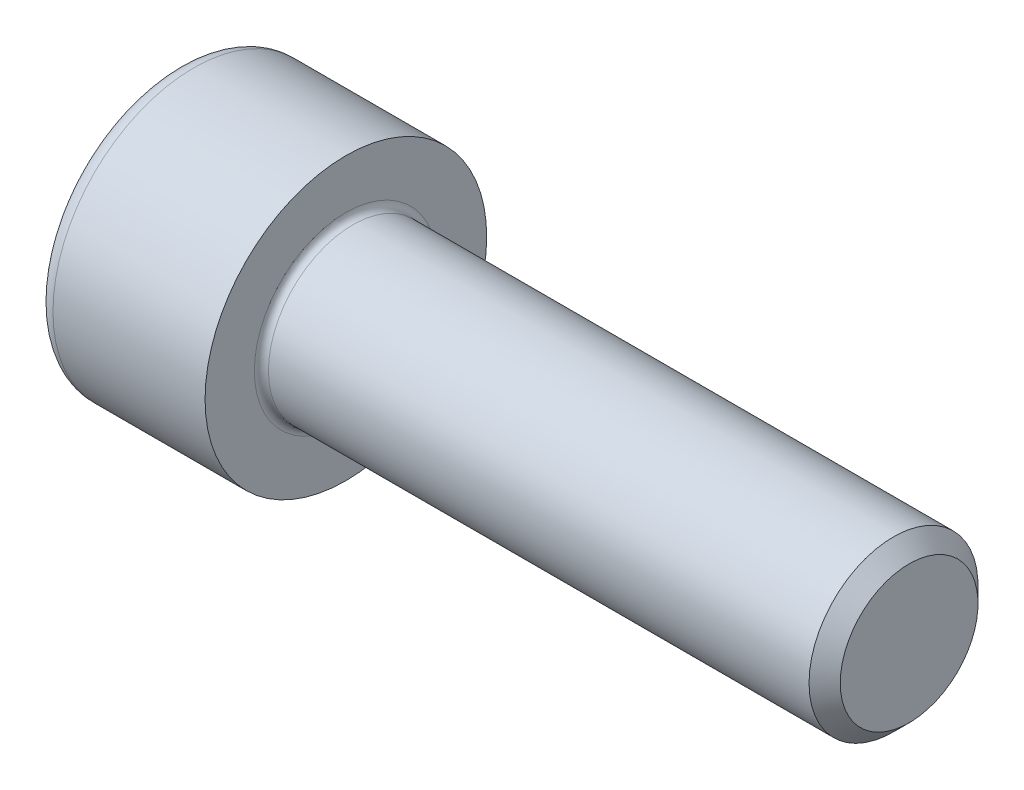
ISO-10303-21;
HEADER;
FILE_DESCRIPTION(('STEP AP214'),'2;1');
FILE_NAME('part.step','',(''),(''),'','','');
FILE_SCHEMA(('AUTOMOTIVE_DESIGN { 1 0 10303 214 1 1 1 1 }'));
ENDSEC;
DATA;
#1=APPLICATION_CONTEXT('core data for automotive mechanical design processes');
#2=APPLICATION_PROTOCOL_DEFINITION('international standard','automotive_design',2000,#1);
#3=PRODUCT_CONTEXT('',#1,'mechanical');
#4=PRODUCT('Part','Part','',(#3));
#5=PRODUCT_RELATED_PRODUCT_CATEGORY('part','',(#4));
#6=PRODUCT_DEFINITION_FORMATION('','',#4);
#7=PRODUCT_DEFINITION_CONTEXT('part definition',#1,'design');
#8=PRODUCT_DEFINITION('design','',#6,#7);
#9=PRODUCT_DEFINITION_SHAPE('','',#8);
#10=(LENGTH_UNIT() NAMED_UNIT(*) SI_UNIT(.MILLI.,.METRE.));
#11=(NAMED_UNIT(*) PLANE_ANGLE_UNIT() SI_UNIT($,.RADIAN.));
#12=(NAMED_UNIT(*) SI_UNIT($,.STERADIAN.) SOLID_ANGLE_UNIT());
#13=UNCERTAINTY_MEASURE_WITH_UNIT(LENGTH_MEASURE(1.E-05),#10,'distance_accuracy_value','');
#14=(GEOMETRIC_REPRESENTATION_CONTEXT(3) GLOBAL_UNCERTAINTY_ASSIGNED_CONTEXT((#13)) GLOBAL_UNIT_ASSIGNED_CONTEXT((#10,
#11,#12)) REPRESENTATION_CONTEXT('',''));
#15=CARTESIAN_POINT('',(0.,0.,0.));
#16=DIRECTION('',(0.,0.,1.));
#17=DIRECTION('',(1.,0.,0.));
#18=AXIS2_PLACEMENT_3D('',#15,#16,#17);
#19=CARTESIAN_POINT('',(3.,2.89829835133192,0.));
#20=DIRECTION('',(1.,0.,0.));
#21=DIRECTION('',(0.,0.,-1.));
#22=AXIS2_PLACEMENT_3D('',#19,#20,#21);
#23=PLANE('',#22);
#24=DIRECTION('',(0.,1.,0.));
#25=VECTOR('',#24,1.);
#26=CARTESIAN_POINT('',(3.,2.89829835133192,2.51));
#27=LINE('',#26,#25);
#28=CARTESIAN_POINT('',(2.99999999998283,0.,2.50999999995049));
#29=VERTEX_POINT('',#28);
#30=CARTESIAN_POINT('',(3.,-1.44914917566596,2.51));
#31=VERTEX_POINT('',#30);
#32=EDGE_CURVE('E101',#29,#31,#27,.F.);
#33=ORIENTED_EDGE('',*,*,#32,.F.);
#34=CARTESIAN_POINT('',(2.99999999994429,0.,0.));
#35=DIRECTION('',(-1.,0.,0.));
#36=DIRECTION('',(0.,-1.,0.));
#37=AXIS2_PLACEMENT_3D('',#34,#35,#36);
#38=CIRCLE('',#37,2.50999999997248);
#39=CARTESIAN_POINT('',(2.99999999997215,-2.17372376348702,1.25499999999312));
#40=VERTEX_POINT('',#39);
#41=EDGE_CURVE('E103',#29,#40,#38,.F.);
#42=ORIENTED_EDGE('',*,*,#41,.T.);
#43=DIRECTION('',(0.,-0.500000000000001,-0.866025403784438));
#44=VECTOR('',#43,1.);
#45=CARTESIAN_POINT('',(3.,-1.44914917566596,2.51));
#46=LINE('',#45,#44);
#47=EDGE_CURVE('E106',#31,#40,#46,.T.);
#48=ORIENTED_EDGE('',*,*,#47,.F.);
#49=EDGE_LOOP('',(#33,#42,#48));
#50=FACE_BOUND('',#49,.T.);
#51=ADVANCED_FACE('F16',(#50),#23,.F.);
#52=CARTESIAN_POINT('',(3.,2.89829835133192,0.));
#53=DIRECTION('',(1.,0.,0.));
#54=DIRECTION('',(0.,0.,-1.));
#55=AXIS2_PLACEMENT_3D('',#52,#53,#54);
#56=PLANE('',#55);
#57=DIRECTION('',(0.,-0.500000000000001,-0.866025403784438));
#58=VECTOR('',#57,1.);
#59=CARTESIAN_POINT('',(3.,-2.17372376349894,1.255));
#60=LINE('',#59,#58);
#61=CARTESIAN_POINT('',(3.,-2.89829835133193,0.));
#62=VERTEX_POINT('',#61);
#63=EDGE_CURVE('E175',#40,#62,#60,.T.);
#64=ORIENTED_EDGE('',*,*,#63,.F.);
#65=CARTESIAN_POINT('',(2.99999999994429,0.,0.));
#66=DIRECTION('',(-1.,0.,0.));
#67=DIRECTION('',(0.,-1.,0.));
#68=AXIS2_PLACEMENT_3D('',#65,#66,#67);
#69=CIRCLE('',#68,2.50999999997248);
#70=CARTESIAN_POINT('',(2.99999999997215,-2.17372376348703,-1.25499999999312));
#71=VERTEX_POINT('',#70);
#72=EDGE_CURVE('E121',#40,#71,#69,.F.);
#73=ORIENTED_EDGE('',*,*,#72,.T.);
#74=DIRECTION('',(0.,0.5,-0.866025403784439));
#75=VECTOR('',#74,1.);
#76=CARTESIAN_POINT('',(3.,-2.89829835133193,0.));
#77=LINE('',#76,#75);
#78=EDGE_CURVE('E171',#62,#71,#77,.T.);
#79=ORIENTED_EDGE('',*,*,#78,.F.);
#80=EDGE_LOOP('',(#64,#73,#79));
#81=FACE_BOUND('',#80,.T.);
#82=ADVANCED_FACE('F365',(#81),#56,.F.);
#83=CARTESIAN_POINT('',(3.,2.89829835133192,0.));
#84=DIRECTION('',(1.,0.,0.));
#85=DIRECTION('',(0.,0.,-1.));
#86=AXIS2_PLACEMENT_3D('',#83,#84,#85);
#87=PLANE('',#86);
#88=DIRECTION('',(0.,0.499999999999998,-0.86602540378444));
#89=VECTOR('',#88,1.);
#90=CARTESIAN_POINT('',(3.,-2.17372376349895,-1.255));
#91=LINE('',#90,#89);
#92=CARTESIAN_POINT('',(3.,-1.44914917566597,-2.51));
#93=VERTEX_POINT('',#92);
#94=EDGE_CURVE('E167',#71,#93,#91,.T.);
#95=ORIENTED_EDGE('',*,*,#94,.F.);
#96=CARTESIAN_POINT('',(2.99999999994429,0.,0.));
#97=DIRECTION('',(-1.,0.,0.));
#98=DIRECTION('',(0.,-1.,0.));
#99=AXIS2_PLACEMENT_3D('',#96,#97,#98);
#100=CIRCLE('',#99,2.50999999997248);
#101=CARTESIAN_POINT('',(2.99999999998283,0.,-2.50999999995049));
#102=VERTEX_POINT('',#101);
#103=EDGE_CURVE('E221',#71,#102,#100,.F.);
#104=ORIENTED_EDGE('',*,*,#103,.T.);
#105=DIRECTION('',(0.,1.,0.));
#106=VECTOR('',#105,1.);
#107=CARTESIAN_POINT('',(3.,2.89829835133192,-2.51));
#108=LINE('',#107,#106);
#109=EDGE_CURVE('E163',#93,#102,#108,.T.);
#110=ORIENTED_EDGE('',*,*,#109,.F.);
#111=EDGE_LOOP('',(#95,#104,#110));
#112=FACE_BOUND('',#111,.T.);
#113=ADVANCED_FACE('F359',(#112),#87,.F.);
#114=CARTESIAN_POINT('',(3.,2.89829835133192,0.));
#115=DIRECTION('',(1.,0.,0.));
#116=DIRECTION('',(0.,0.,-1.));
#117=AXIS2_PLACEMENT_3D('',#114,#115,#116);
#118=PLANE('',#117);
#119=DIRECTION('',(0.,1.,0.));
#120=VECTOR('',#119,1.);
#121=CARTESIAN_POINT('',(3.,2.89829835133192,-2.51));
#122=LINE('',#121,#120);
#123=CARTESIAN_POINT('',(3.,1.44914917566595,-2.51));
#124=VERTEX_POINT('',#123);
#125=EDGE_CURVE('E159',#102,#124,#122,.T.);
#126=ORIENTED_EDGE('',*,*,#125,.F.);
#127=CARTESIAN_POINT('',(2.99999999994429,0.,0.));
#128=DIRECTION('',(-1.,0.,0.));
#129=DIRECTION('',(0.,-1.,0.));
#130=AXIS2_PLACEMENT_3D('',#127,#128,#129);
#131=CIRCLE('',#130,2.50999999997248);
#132=CARTESIAN_POINT('',(2.99999999997215,2.17372376348702,-1.25499999999312));
#133=VERTEX_POINT('',#132);
#134=EDGE_CURVE('E218',#102,#133,#131,.F.);
#135=ORIENTED_EDGE('',*,*,#134,.T.);
#136=DIRECTION('',(0.,0.500000000000002,0.866025403784438));
#137=VECTOR('',#136,1.);
#138=CARTESIAN_POINT('',(3.,1.44914917566595,-2.51));
#139=LINE('',#138,#137);
#140=EDGE_CURVE('E155',#124,#133,#139,.T.);
#141=ORIENTED_EDGE('',*,*,#140,.F.);
#142=EDGE_LOOP('',(#126,#135,#141));
#143=FACE_BOUND('',#142,.T.);
#144=ADVANCED_FACE('F351',(#143),#118,.F.);
#145=CARTESIAN_POINT('',(3.,2.89829835133192,0.));
#146=DIRECTION('',(1.,0.,0.));
#147=DIRECTION('',(0.,0.,-1.));
#148=AXIS2_PLACEMENT_3D('',#145,#146,#147);
#149=PLANE('',#148);
#150=DIRECTION('',(0.,0.500000000000001,0.866025403784438));
#151=VECTOR('',#150,1.);
#152=CARTESIAN_POINT('',(3.,2.17372376349894,-1.255));
#153=LINE('',#152,#151);
#154=CARTESIAN_POINT('',(3.,2.89829835133192,0.));
#155=VERTEX_POINT('',#154);
#156=EDGE_CURVE('E151',#133,#155,#153,.T.);
#157=ORIENTED_EDGE('',*,*,#156,.F.);
#158=CARTESIAN_POINT('',(2.99999999994429,0.,0.));
#159=DIRECTION('',(-1.,0.,0.));
#160=DIRECTION('',(0.,-1.,0.));
#161=AXIS2_PLACEMENT_3D('',#158,#159,#160);
#162=CIRCLE('',#161,2.50999999997248);
#163=CARTESIAN_POINT('',(2.99999999997215,2.17372376348702,1.25499999999312));
#164=VERTEX_POINT('',#163);
#165=EDGE_CURVE('E129',#133,#164,#162,.F.);
#166=ORIENTED_EDGE('',*,*,#165,.T.);
#167=DIRECTION('',(0.,-0.499999999999999,0.866025403784439));
#168=VECTOR('',#167,1.);
#169=CARTESIAN_POINT('',(3.,2.89829835133192,0.));
#170=LINE('',#169,#168);
#171=EDGE_CURVE('E122',#155,#164,#170,.T.);
#172=ORIENTED_EDGE('',*,*,#171,.F.);
#173=EDGE_LOOP('',(#157,#166,#172));
#174=FACE_BOUND('',#173,.T.);
#175=ADVANCED_FACE('F347',(#174),#149,.F.);
#176=CARTESIAN_POINT('',(3.00000000004275,0.,0.));
#177=DIRECTION('',(-1.,0.,0.));
#178=DIRECTION('',(0.,-1.,0.));
#179=AXIS2_PLACEMENT_3D('',#176,#177,#178);
#180=CONICAL_SURFACE('',#179,2.50999999980195,1.04719755107689);
#181=CARTESIAN_POINT('',(4.44914917551387,0.,1.13686837721616E-10));
#182=VERTEX_POINT('',#181);
#183=VERTEX_LOOP('',#182);
#184=FACE_BOUND('',#183,.T.);
#185=ORIENTED_EDGE('',*,*,#41,.F.);
#186=CARTESIAN_POINT('',(2.99999999994429,0.,0.));
#187=DIRECTION('',(-1.,0.,0.));
#188=DIRECTION('',(0.,-1.,0.));
#189=AXIS2_PLACEMENT_3D('',#186,#187,#188);
#190=CIRCLE('',#189,2.50999999997248);
#191=EDGE_CURVE('E117',#29,#164,#190,.T.);
#192=ORIENTED_EDGE('',*,*,#191,.T.);
#193=ORIENTED_EDGE('',*,*,#165,.F.);
#194=ORIENTED_EDGE('',*,*,#134,.F.);
#195=ORIENTED_EDGE('',*,*,#103,.F.);
#196=ORIENTED_EDGE('',*,*,#72,.F.);
#197=EDGE_LOOP('',(#185,#192,#193,#194,#195,#196));
#198=FACE_BOUND('',#197,.T.);
#199=ADVANCED_FACE('F115',(#184,#198),#180,.F.);
#200=CARTESIAN_POINT('',(3.,2.89829835133192,0.));
#201=DIRECTION('',(1.,0.,0.));
#202=DIRECTION('',(0.,0.,-1.));
#203=AXIS2_PLACEMENT_3D('',#200,#201,#202);
#204=PLANE('',#203);
#205=DIRECTION('',(0.,0.499999999999999,-0.866025403784439));
#206=VECTOR('',#205,1.);
#207=CARTESIAN_POINT('',(3.,2.89829835133192,0.));
#208=LINE('',#207,#206);
#209=CARTESIAN_POINT('',(3.,1.44914917566596,2.51));
#210=VERTEX_POINT('',#209);
#211=EDGE_CURVE('E128',#164,#210,#208,.F.);
#212=ORIENTED_EDGE('',*,*,#211,.F.);
#213=ORIENTED_EDGE('',*,*,#191,.F.);
#214=DIRECTION('',(0.,-1.,0.));
#215=VECTOR('',#214,1.);
#216=CARTESIAN_POINT('',(3.,-1.44914917566596,2.51));
#217=LINE('',#216,#215);
#218=EDGE_CURVE('E126',#29,#210,#217,.F.);
#219=ORIENTED_EDGE('',*,*,#218,.T.);
#220=EDGE_LOOP('',(#212,#213,#219));
#221=FACE_BOUND('',#220,.T.);
#222=ADVANCED_FACE('F125',(#221),#204,.F.);
#223=CARTESIAN_POINT('',(3.,2.89829835133192,0.));
#224=DIRECTION('',(0.,-0.866025403784439,-0.499999999999999));
#225=DIRECTION('',(0.,0.499999999999999,-0.866025403784439));
#226=AXIS2_PLACEMENT_3D('',#223,#224,#225);
#227=PLANE('',#226);
#228=ORIENTED_EDGE('',*,*,#211,.T.);
#229=DIRECTION('',(1.,0.,0.));
#230=VECTOR('',#229,1.);
#231=CARTESIAN_POINT('',(3.,1.44914917566596,2.51));
#232=LINE('',#231,#230);
#233=CARTESIAN_POINT('',(0.,1.44914917566596,2.51));
#234=VERTEX_POINT('',#233);
#235=EDGE_CURVE('E134',#210,#234,#232,.F.);
#236=ORIENTED_EDGE('',*,*,#235,.T.);
#237=DIRECTION('',(0.,-0.499999999999999,0.866025403784439));
#238=VECTOR('',#237,1.);
#239=CARTESIAN_POINT('',(0.,2.89829835133192,0.));
#240=LINE('',#239,#238);
#241=CARTESIAN_POINT('',(0.,2.89829835133192,0.));
#242=VERTEX_POINT('',#241);
#243=EDGE_CURVE('E194',#242,#234,#240,.T.);
#244=ORIENTED_EDGE('',*,*,#243,.F.);
#245=DIRECTION('',(1.,0.,0.));
#246=VECTOR('',#245,1.);
#247=CARTESIAN_POINT('',(3.,2.89829835133192,0.));
#248=LINE('',#247,#246);
#249=EDGE_CURVE('E186',#242,#155,#248,.T.);
#250=ORIENTED_EDGE('',*,*,#249,.T.);
#251=ORIENTED_EDGE('',*,*,#171,.T.);
#252=EDGE_LOOP('',(#228,#236,#244,#250,#251));
#253=FACE_BOUND('',#252,.T.);
#254=ADVANCED_FACE('F340',(#253),#227,.T.);
#255=CARTESIAN_POINT('',(3.,-1.44914917566596,2.51));
#256=DIRECTION('',(0.,0.,1.));
#257=DIRECTION('',(0.,-1.,0.));
#258=AXIS2_PLACEMENT_3D('',#255,#256,#257);
#259=PLANE('',#258);
#260=ORIENTED_EDGE('',*,*,#235,.F.);
#261=ORIENTED_EDGE('',*,*,#218,.F.);
#262=ORIENTED_EDGE('',*,*,#32,.T.);
#263=DIRECTION('',(1.,0.,0.));
#264=VECTOR('',#263,1.);
#265=CARTESIAN_POINT('',(3.,-1.44914917566596,2.51));
#266=LINE('',#265,#264);
#267=CARTESIAN_POINT('',(0.,-1.44914917566596,2.51));
#268=VERTEX_POINT('',#267);
#269=EDGE_CURVE('E136',#268,#31,#266,.T.);
#270=ORIENTED_EDGE('',*,*,#269,.F.);
#271=DIRECTION('',(0.,1.,0.));
#272=VECTOR('',#271,1.);
#273=CARTESIAN_POINT('',(0.,0.,2.51));
#274=LINE('',#273,#272);
#275=EDGE_CURVE('E335',#234,#268,#274,.F.);
#276=ORIENTED_EDGE('',*,*,#275,.F.);
#277=EDGE_LOOP('',(#260,#261,#262,#270,#276));
#278=FACE_BOUND('',#277,.T.);
#279=ADVANCED_FACE('F132',(#278),#259,.F.);
#280=CARTESIAN_POINT('',(3.,-1.44914917566596,2.51));
#281=DIRECTION('',(0.,0.866025403784438,-0.500000000000001));
#282=DIRECTION('',(0.,0.500000000000001,0.866025403784438));
#283=AXIS2_PLACEMENT_3D('',#280,#281,#282);
#284=PLANE('',#283);
#285=ORIENTED_EDGE('',*,*,#63,.T.);
#286=DIRECTION('',(1.,0.,0.));
#287=VECTOR('',#286,1.);
#288=CARTESIAN_POINT('',(3.,-2.89829835133193,0.));
#289=LINE('',#288,#287);
#290=CARTESIAN_POINT('',(0.,-2.89829835133193,0.));
#291=VERTEX_POINT('',#290);
#292=EDGE_CURVE('E198',#291,#62,#289,.T.);
#293=ORIENTED_EDGE('',*,*,#292,.F.);
#294=DIRECTION('',(0.,-0.500000000000001,-0.866025403784438));
#295=VECTOR('',#294,1.);
#296=CARTESIAN_POINT('',(0.,-1.44914917566596,2.51));
#297=LINE('',#296,#295);
#298=EDGE_CURVE('E332',#268,#291,#297,.T.);
#299=ORIENTED_EDGE('',*,*,#298,.F.);
#300=ORIENTED_EDGE('',*,*,#269,.T.);
#301=ORIENTED_EDGE('',*,*,#47,.T.);
#302=EDGE_LOOP('',(#285,#293,#299,#300,#301));
#303=FACE_BOUND('',#302,.T.);
#304=ADVANCED_FACE('F367',(#303),#284,.T.);
#305=CARTESIAN_POINT('',(3.,-2.89829835133193,0.));
#306=DIRECTION('',(0.,0.866025403784439,0.499999999999999));
#307=DIRECTION('',(0.,-0.499999999999999,0.866025403784439));
#308=AXIS2_PLACEMENT_3D('',#305,#306,#307);
#309=PLANE('',#308);
#310=ORIENTED_EDGE('',*,*,#94,.T.);
#311=DIRECTION('',(1.,0.,0.));
#312=VECTOR('',#311,1.);
#313=CARTESIAN_POINT('',(3.,-1.44914917566597,-2.51));
#314=LINE('',#313,#312);
#315=CARTESIAN_POINT('',(0.,-1.44914917566597,-2.51));
#316=VERTEX_POINT('',#315);
#317=EDGE_CURVE('E190',#93,#316,#314,.F.);
#318=ORIENTED_EDGE('',*,*,#317,.T.);
#319=DIRECTION('',(0.,0.499999999999999,-0.866025403784439));
#320=VECTOR('',#319,1.);
#321=CARTESIAN_POINT('',(0.,-2.89829835133193,0.));
#322=LINE('',#321,#320);
#323=EDGE_CURVE('E327',#291,#316,#322,.T.);
#324=ORIENTED_EDGE('',*,*,#323,.F.);
#325=ORIENTED_EDGE('',*,*,#292,.T.);
#326=ORIENTED_EDGE('',*,*,#78,.T.);
#327=EDGE_LOOP('',(#310,#318,#324,#325,#326));
#328=FACE_BOUND('',#327,.T.);
#329=ADVANCED_FACE('F361',(#328),#309,.T.);
#330=CARTESIAN_POINT('',(3.,1.44914917566595,-2.51));
#331=DIRECTION('',(0.,0.,-1.));
#332=DIRECTION('',(0.,1.,0.));
#333=AXIS2_PLACEMENT_3D('',#330,#331,#332);
#334=PLANE('',#333);
#335=ORIENTED_EDGE('',*,*,#317,.F.);
#336=ORIENTED_EDGE('',*,*,#109,.T.);
#337=ORIENTED_EDGE('',*,*,#125,.T.);
#338=DIRECTION('',(1.,0.,0.));
#339=VECTOR('',#338,1.);
#340=CARTESIAN_POINT('',(3.,1.44914917566595,-2.51));
#341=LINE('',#340,#339);
#342=CARTESIAN_POINT('',(0.,1.44914917566595,-2.51));
#343=VERTEX_POINT('',#342);
#344=EDGE_CURVE('E189',#124,#343,#341,.F.);
#345=ORIENTED_EDGE('',*,*,#344,.T.);
#346=DIRECTION('',(0.,1.,0.));
#347=VECTOR('',#346,1.);
#348=CARTESIAN_POINT('',(0.,0.,-2.51));
#349=LINE('',#348,#347);
#350=EDGE_CURVE('E323',#316,#343,#349,.T.);
#351=ORIENTED_EDGE('',*,*,#350,.F.);
#352=EDGE_LOOP('',(#335,#336,#337,#345,#351));
#353=FACE_BOUND('',#352,.T.);
#354=ADVANCED_FACE('F354',(#353),#334,.F.);
#355=CARTESIAN_POINT('',(3.,2.89829835133192,0.));
#356=DIRECTION('',(0.,0.866025403784438,-0.500000000000001));
#357=DIRECTION('',(0.,0.500000000000001,0.866025403784438));
#358=AXIS2_PLACEMENT_3D('',#355,#356,#357);
#359=PLANE('',#358);
#360=ORIENTED_EDGE('',*,*,#344,.F.);
#361=ORIENTED_EDGE('',*,*,#140,.T.);
#362=ORIENTED_EDGE('',*,*,#156,.T.);
#363=ORIENTED_EDGE('',*,*,#249,.F.);
#364=DIRECTION('',(0.,0.500000000000001,0.866025403784438));
#365=VECTOR('',#364,1.);
#366=CARTESIAN_POINT('',(0.,1.44914917566595,-2.51));
#367=LINE('',#366,#365);
#368=EDGE_CURVE('E321',#343,#242,#367,.T.);
#369=ORIENTED_EDGE('',*,*,#368,.F.);
#370=EDGE_LOOP('',(#360,#361,#362,#363,#369));
#371=FACE_BOUND('',#370,.T.);
#372=ADVANCED_FACE('F297',(#371),#359,.F.);
#373=CARTESIAN_POINT('',(0.,0.,0.));
#374=DIRECTION('',(-1.,0.,0.));
#375=DIRECTION('',(0.,0.,1.));
#376=AXIS2_PLACEMENT_3D('',#373,#374,#375);
#377=PLANE('',#376);
#378=CARTESIAN_POINT('',(0.,0.,0.));
#379=DIRECTION('',(1.,0.,0.));
#380=DIRECTION('',(0.,0.,-1.));
#381=AXIS2_PLACEMENT_3D('',#378,#379,#380);
#382=CIRCLE('',#381,4.4);
#383=CARTESIAN_POINT('',(0.,0.,-4.4));
#384=VERTEX_POINT('',#383);
#385=CARTESIAN_POINT('',(0.,0.,4.4));
#386=VERTEX_POINT('',#385);
#387=EDGE_CURVE('E318',#384,#386,#382,.T.);
#388=ORIENTED_EDGE('',*,*,#387,.F.);
#389=CARTESIAN_POINT('',(0.,0.,0.));
#390=DIRECTION('',(1.,0.,0.));
#391=DIRECTION('',(0.,0.,1.));
#392=AXIS2_PLACEMENT_3D('',#389,#390,#391);
#393=CIRCLE('',#392,4.4);
#394=EDGE_CURVE('E316',#386,#384,#393,.T.);
#395=ORIENTED_EDGE('',*,*,#394,.F.);
#396=EDGE_LOOP('',(#388,#395));
#397=FACE_BOUND('',#396,.T.);
#398=ORIENTED_EDGE('',*,*,#350,.T.);
#399=ORIENTED_EDGE('',*,*,#368,.T.);
#400=ORIENTED_EDGE('',*,*,#243,.T.);
#401=ORIENTED_EDGE('',*,*,#275,.T.);
#402=ORIENTED_EDGE('',*,*,#298,.T.);
#403=ORIENTED_EDGE('',*,*,#323,.T.);
#404=EDGE_LOOP('',(#398,#399,#400,#401,#402,#403));
#405=FACE_BOUND('',#404,.T.);
#406=ADVANCED_FACE('F291',(#397,#405),#377,.T.);
#407=CARTESIAN_POINT('',(0.600000000000003,0.,0.));
#408=DIRECTION('',(-1.,0.,0.));
#409=DIRECTION('',(0.,0.,1.));
#410=AXIS2_PLACEMENT_3D('',#407,#408,#409);
#411=TOROIDAL_SURFACE('',#410,4.4,0.6);
#412=CARTESIAN_POINT('',(0.600000000000003,0.,0.));
#413=DIRECTION('',(-1.,0.,0.));
#414=DIRECTION('',(0.,0.,1.));
#415=AXIS2_PLACEMENT_3D('',#412,#413,#414);
#416=CIRCLE('',#415,5.);
#417=CARTESIAN_POINT('',(0.600000000000003,0.,5.));
#418=VERTEX_POINT('',#417);
#419=EDGE_CURVE('E214',#418,#418,#416,.F.);
#420=ORIENTED_EDGE('',*,*,#419,.F.);
#421=EDGE_LOOP('',(#420));
#422=FACE_BOUND('',#421,.T.);
#423=ORIENTED_EDGE('',*,*,#394,.T.);
#424=ORIENTED_EDGE('',*,*,#387,.T.);
#425=EDGE_LOOP('',(#423,#424));
#426=FACE_BOUND('',#425,.T.);
#427=ADVANCED_FACE('F286',(#422,#426),#411,.T.);
#428=CARTESIAN_POINT('',(-31.75,0.,0.));
#429=DIRECTION('',(-1.,0.,0.));
#430=DIRECTION('',(0.,0.,1.));
#431=AXIS2_PLACEMENT_3D('',#428,#429,#430);
#432=CYLINDRICAL_SURFACE('',#431,5.);
#433=CARTESIAN_POINT('',(6.,0.,0.));
#434=DIRECTION('',(-1.,0.,0.));
#435=DIRECTION('',(0.,0.,1.));
#436=AXIS2_PLACEMENT_3D('',#433,#434,#435);
#437=CIRCLE('',#436,5.);
#438=CARTESIAN_POINT('',(6.,0.,5.));
#439=VERTEX_POINT('',#438);
#440=EDGE_CURVE('E212',#439,#439,#437,.F.);
#441=ORIENTED_EDGE('',*,*,#440,.F.);
#442=EDGE_LOOP('',(#441));
#443=FACE_BOUND('',#442,.T.);
#444=ORIENTED_EDGE('',*,*,#419,.T.);
#445=EDGE_LOOP('',(#444));
#446=FACE_BOUND('',#445,.T.);
#447=ADVANCED_FACE('F290',(#443,#446),#432,.T.);
#448=CARTESIAN_POINT('',(26.,2.4455,0.));
#449=DIRECTION('',(1.,0.,0.));
#450=DIRECTION('',(0.,0.,-1.));
#451=AXIS2_PLACEMENT_3D('',#448,#449,#450);
#452=PLANE('',#451);
#453=CARTESIAN_POINT('',(25.9999999999536,0.,0.));
#454=DIRECTION('',(-1.,0.,0.));
#455=DIRECTION('',(0.,0.,1.));
#456=AXIS2_PLACEMENT_3D('',#453,#454,#455);
#457=CIRCLE('',#456,2.44550000002164);
#458=CARTESIAN_POINT('',(25.9999999999536,0.,2.44550000002164));
#459=VERTEX_POINT('',#458);
#460=EDGE_CURVE('E208',#459,#459,#457,.T.);
#461=ORIENTED_EDGE('',*,*,#460,.F.);
#462=EDGE_LOOP('',(#461));
#463=FACE_BOUND('',#462,.T.);
#464=ADVANCED_FACE('F263',(#463),#452,.T.);
#465=CARTESIAN_POINT('',(6.,5.,0.));
#466=DIRECTION('',(1.,0.,0.));
#467=DIRECTION('',(0.,0.,-1.));
#468=AXIS2_PLACEMENT_3D('',#465,#466,#467);
#469=PLANE('',#468);
#470=ORIENTED_EDGE('',*,*,#440,.T.);
#471=EDGE_LOOP('',(#470));
#472=FACE_BOUND('',#471,.T.);
#473=CARTESIAN_POINT('',(6.,0.,0.));
#474=DIRECTION('',(1.,0.,0.));
#475=DIRECTION('',(0.,0.,1.));
#476=AXIS2_PLACEMENT_3D('',#473,#474,#475);
#477=CIRCLE('',#476,3.24999999999999);
#478=CARTESIAN_POINT('',(6.,0.,-3.24999999999999));
#479=VERTEX_POINT('',#478);
#480=CARTESIAN_POINT('',(6.,0.,3.24999999999999));
#481=VERTEX_POINT('',#480);
#482=EDGE_CURVE('E211',#479,#481,#477,.F.);
#483=ORIENTED_EDGE('',*,*,#482,.T.);
#484=CARTESIAN_POINT('',(6.,0.,0.));
#485=DIRECTION('',(1.,0.,0.));
#486=DIRECTION('',(0.,0.,-1.));
#487=AXIS2_PLACEMENT_3D('',#484,#485,#486);
#488=CIRCLE('',#487,3.24999999999999);
#489=EDGE_CURVE('E35',#481,#479,#488,.F.);
#490=ORIENTED_EDGE('',*,*,#489,.T.);
#491=EDGE_LOOP('',(#483,#490));
#492=FACE_BOUND('',#491,.T.);
#493=ADVANCED_FACE('F254',(#472,#492),#469,.T.);
#494=CARTESIAN_POINT('',(25.4455000000462,0.,0.));
#495=DIRECTION('',(-1.,0.,0.));
#496=DIRECTION('',(0.,0.,1.));
#497=AXIS2_PLACEMENT_3D('',#494,#495,#496);
#498=CONICAL_SURFACE('',#497,2.99999999987222,0.785398163346192);
#499=CARTESIAN_POINT('',(25.4455,0.,0.));
#500=DIRECTION('',(-1.,0.,0.));
#501=DIRECTION('',(0.,0.,1.));
#502=AXIS2_PLACEMENT_3D('',#499,#500,#501);
#503=CIRCLE('',#502,2.99999999999999);
#504=CARTESIAN_POINT('',(25.4455,0.,2.99999999999999));
#505=VERTEX_POINT('',#504);
#506=EDGE_CURVE('E27',#505,#505,#503,.T.);
#507=ORIENTED_EDGE('',*,*,#506,.F.);
#508=EDGE_LOOP('',(#507));
#509=FACE_BOUND('',#508,.T.);
#510=ORIENTED_EDGE('',*,*,#460,.T.);
#511=EDGE_LOOP('',(#510));
#512=FACE_BOUND('',#511,.T.);
#513=ADVANCED_FACE('F242',(#509,#512),#498,.T.);
#514=CARTESIAN_POINT('',(6.25,0.,0.));
#515=DIRECTION('',(1.,0.,0.));
#516=DIRECTION('',(0.,0.,-1.));
#517=AXIS2_PLACEMENT_3D('',#514,#515,#516);
#518=TOROIDAL_SURFACE('',#517,3.24999999999999,0.25);
#519=CARTESIAN_POINT('',(6.25,0.,0.));
#520=DIRECTION('',(-1.,0.,0.));
#521=DIRECTION('',(0.,0.,1.));
#522=AXIS2_PLACEMENT_3D('',#519,#520,#521);
#523=CIRCLE('',#522,2.99999999999999);
#524=CARTESIAN_POINT('',(6.25,0.,2.99999999999999));
#525=VERTEX_POINT('',#524);
#526=EDGE_CURVE('E11',#525,#525,#523,.F.);
#527=ORIENTED_EDGE('',*,*,#526,.F.);
#528=EDGE_LOOP('',(#527));
#529=FACE_BOUND('',#528,.T.);
#530=ORIENTED_EDGE('',*,*,#482,.F.);
#531=ORIENTED_EDGE('',*,*,#489,.F.);
#532=EDGE_LOOP('',(#530,#531));
#533=FACE_BOUND('',#532,.T.);
#534=ADVANCED_FACE('F230',(#529,#533),#518,.F.);
#535=CARTESIAN_POINT('',(-31.75,0.,0.));
#536=DIRECTION('',(-1.,0.,0.));
#537=DIRECTION('',(0.,0.,1.));
#538=AXIS2_PLACEMENT_3D('',#535,#536,#537);
#539=CYLINDRICAL_SURFACE('',#538,2.99999999999999);
#540=ORIENTED_EDGE('',*,*,#526,.T.);
#541=EDGE_LOOP('',(#540));
#542=FACE_BOUND('',#541,.T.);
#543=ORIENTED_EDGE('',*,*,#506,.T.);
#544=EDGE_LOOP('',(#543));
#545=FACE_BOUND('',#544,.T.);
#546=ADVANCED_FACE('F241',(#542,#545),#539,.T.);
#547=CLOSED_SHELL('',(#51,#82,#113,#144,#175,#199,#222,#254,#279,#304,#329,#354,#372,#406,#427,
#447,#464,#493,#513,#534,#546));
#548=MANIFOLD_SOLID_BREP('B1',#547);
#549=ADVANCED_BREP_SHAPE_REPRESENTATION('',(#18,#548),#14);
#550=SHAPE_DEFINITION_REPRESENTATION(#9,#549);
ENDSEC;
END-ISO-10303-21;
